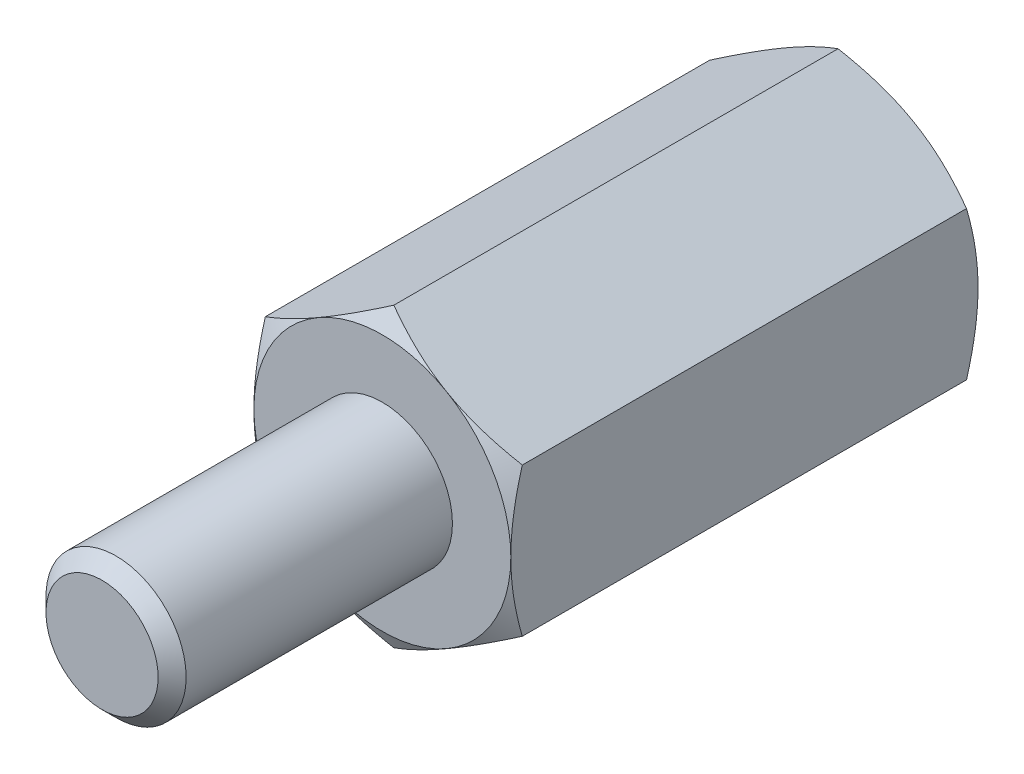
ISO-10303-21;
HEADER;
FILE_DESCRIPTION(('STEP AP214'),'2;1');
FILE_NAME('part.step','',(''),(''),'','','');
FILE_SCHEMA(('AUTOMOTIVE_DESIGN { 1 0 10303 214 1 1 1 1 }'));
ENDSEC;
DATA;
#1=APPLICATION_CONTEXT('core data for automotive mechanical design processes');
#2=APPLICATION_PROTOCOL_DEFINITION('international standard','automotive_design',2000,#1);
#3=PRODUCT_CONTEXT('',#1,'mechanical');
#4=PRODUCT('Part','Part','',(#3));
#5=PRODUCT_RELATED_PRODUCT_CATEGORY('part','',(#4));
#6=PRODUCT_DEFINITION_FORMATION('','',#4);
#7=PRODUCT_DEFINITION_CONTEXT('part definition',#1,'design');
#8=PRODUCT_DEFINITION('design','',#6,#7);
#9=PRODUCT_DEFINITION_SHAPE('','',#8);
#10=(LENGTH_UNIT() NAMED_UNIT(*) SI_UNIT(.MILLI.,.METRE.));
#11=(NAMED_UNIT(*) PLANE_ANGLE_UNIT() SI_UNIT($,.RADIAN.));
#12=(NAMED_UNIT(*) SI_UNIT($,.STERADIAN.) SOLID_ANGLE_UNIT());
#13=UNCERTAINTY_MEASURE_WITH_UNIT(LENGTH_MEASURE(1.E-05),#10,'distance_accuracy_value','');
#14=(GEOMETRIC_REPRESENTATION_CONTEXT(3) GLOBAL_UNCERTAINTY_ASSIGNED_CONTEXT((#13)) GLOBAL_UNIT_ASSIGNED_CONTEXT((#10,
#11,#12)) REPRESENTATION_CONTEXT('',''));
#15=CARTESIAN_POINT('',(0.,0.,0.));
#16=DIRECTION('',(0.,0.,1.));
#17=DIRECTION('',(1.,0.,0.));
#18=AXIS2_PLACEMENT_3D('',#15,#16,#17);
#19=CARTESIAN_POINT('',(0.,3.17542648054295,-10.));
#20=DIRECTION('',(-0.5,0.866025403784439,0.));
#21=DIRECTION('',(-0.866025403784439,-0.5,0.));
#22=AXIS2_PLACEMENT_3D('',#19,#20,#21);
#23=PLANE('',#22);
#24=DIRECTION('',(0.,0.,1.));
#25=VECTOR('',#24,1.);
#26=CARTESIAN_POINT('',(0.,3.17542648054295,-10.));
#27=LINE('',#26,#25);
#28=CARTESIAN_POINT('',(0.,3.17542648054295,-9.75437990693814));
#29=VERTEX_POINT('',#28);
#30=CARTESIAN_POINT('',(0.,3.17542648054295,-0.245620093061863));
#31=VERTEX_POINT('',#30);
#32=EDGE_CURVE('E247',#29,#31,#27,.T.);
#33=ORIENTED_EDGE('',*,*,#32,.F.);
#34=CARTESIAN_POINT('',(0.000199999999996883,3.17554195059678,-9.75431323663525));
#35=CARTESIAN_POINT('',(-0.12064922065991,3.10576962051743,-9.79461233775074));
#36=CARTESIAN_POINT('',(-0.242541602622638,3.03539502097908,-9.83126309740234));
#37=CARTESIAN_POINT('',(-0.488437126727897,2.89342717394439,-9.8952378170302));
#38=CARTESIAN_POINT('',(-0.612444638573859,2.82183140359859,-9.9225391443255));
#39=CARTESIAN_POINT('',(-0.858922797975947,2.67952717191843,-9.96503825470588));
#40=CARTESIAN_POINT('',(-0.98135551858742,2.60884060771578,-9.98051888137754));
#41=CARTESIAN_POINT('',(-1.22679714236892,2.46713482015519,-9.99900060263006));
#42=CARTESIAN_POINT('',(-1.34980515323291,2.39611611197038,-10.0020170005374));
#43=CARTESIAN_POINT('',(-1.57965878661079,2.26341005486544,-9.99574685457145));
#44=CARTESIAN_POINT('',(-1.68653879125402,2.20170285541369,-9.9879998457233));
#45=CARTESIAN_POINT('',(-1.89960246733475,2.07869048467395,-9.96344481893564));
#46=CARTESIAN_POINT('',(-2.00578540164889,2.01738573896434,-9.94662841034943));
#47=CARTESIAN_POINT('',(-2.21928848939319,1.89411967378235,-9.90458807765404));
#48=CARTESIAN_POINT('',(-2.32658161614286,1.83217395817123,-9.87918591931277));
#49=CARTESIAN_POINT('',(-2.53956747928405,1.70920651275308,-9.82153277416002));
#50=CARTESIAN_POINT('',(-2.64526294502665,1.64818320715446,-9.78929533670102));
#51=CARTESIAN_POINT('',(-2.7502,1.58759777021763,-9.75431323663524));
#52=B_SPLINE_CURVE_WITH_KNOTS('',3,(#34,#35,#36,#37,#38,#39,#40,#41,#42,#43,#44,#45,#46,#47,#48,
#49,#50,#51),.UNSPECIFIED.,.F.,.F.,(4,2,2,2,2,2,2,2,4),(0.,0.435912828725886,0.872873557116328,
1.29901931904671,1.72464171213573,2.09526089052937,2.46622354066374,2.84541551798557,
3.22386274754524),.UNSPECIFIED.);
#53=CARTESIAN_POINT('',(-1.375,2.38156986040721,-10.));
#54=VERTEX_POINT('',#53);
#55=EDGE_CURVE('E249',#29,#54,#52,.T.);
#56=ORIENTED_EDGE('',*,*,#55,.T.);
#57=CARTESIAN_POINT('',(-2.75,1.58771324027147,-9.75437990693814));
#58=VERTEX_POINT('',#57);
#59=EDGE_CURVE('E184',#54,#58,#52,.T.);
#60=ORIENTED_EDGE('',*,*,#59,.T.);
#61=DIRECTION('',(0.,0.,1.));
#62=VECTOR('',#61,1.);
#63=CARTESIAN_POINT('',(-2.75,1.58771324027147,-10.));
#64=LINE('',#63,#62);
#65=CARTESIAN_POINT('',(-2.75,1.58771324027147,-0.24562009306186));
#66=VERTEX_POINT('',#65);
#67=EDGE_CURVE('E257',#58,#66,#64,.T.);
#68=ORIENTED_EDGE('',*,*,#67,.T.);
#69=CARTESIAN_POINT('',(-2.7502,1.58759777021763,-0.245686763364758));
#70=CARTESIAN_POINT('',(-2.6293507793401,1.65737010029699,-0.205387662249262));
#71=CARTESIAN_POINT('',(-2.50745839737737,1.72774469983534,-0.168736902597662));
#72=CARTESIAN_POINT('',(-2.26156287327211,1.86971254687003,-0.104762182969801));
#73=CARTESIAN_POINT('',(-2.13755536142615,1.94130831721583,-0.0774608556744978));
#74=CARTESIAN_POINT('',(-1.89107720202406,2.08361254889599,-0.0349617452941181));
#75=CARTESIAN_POINT('',(-1.76864448141259,2.15429911309865,-0.0194811186224598));
#76=CARTESIAN_POINT('',(-1.52320285763109,2.29600490065923,-0.000999397369942171));
#77=CARTESIAN_POINT('',(-1.40019484676709,2.36702360884404,0.00201700053739949));
#78=CARTESIAN_POINT('',(-1.17034121338921,2.49972966594897,-0.00425314542854733));
#79=CARTESIAN_POINT('',(-1.06346120874598,2.56143686540073,-0.0120001542767036));
#80=CARTESIAN_POINT('',(-0.850397532665256,2.68444923614047,-0.036555181064356));
#81=CARTESIAN_POINT('',(-0.744214598351116,2.74575398185008,-0.0533715896505709));
#82=CARTESIAN_POINT('',(-0.530711510606821,2.86902004703207,-0.095411922345956));
#83=CARTESIAN_POINT('',(-0.42341838385715,2.93096576264319,-0.12081408068723));
#84=CARTESIAN_POINT('',(-0.210432520715954,3.05393320806134,-0.17846722583998));
#85=CARTESIAN_POINT('',(-0.104737054973352,3.11495651365995,-0.21070466329898));
#86=CARTESIAN_POINT('',(0.000199999999996798,3.17554195059678,-0.245686763364757));
#87=B_SPLINE_CURVE_WITH_KNOTS('',3,(#69,#70,#71,#72,#73,#74,#75,#76,#77,#78,#79,#80,#81,#82,#83,
#84,#85,#86),.UNSPECIFIED.,.F.,.F.,(4,2,2,2,2,2,2,2,4),(0.,0.435912828725887,0.87287355711633,
1.29901931904671,1.72464171213573,2.09526089052937,2.46622354066374,2.84541551798557,
3.22386274754524),.UNSPECIFIED.);
#88=CARTESIAN_POINT('',(-1.375,2.38156986040721,0.));
#89=VERTEX_POINT('',#88);
#90=EDGE_CURVE('E269',#66,#89,#87,.T.);
#91=ORIENTED_EDGE('',*,*,#90,.T.);
#92=EDGE_CURVE('E252',#89,#31,#87,.T.);
#93=ORIENTED_EDGE('',*,*,#92,.T.);
#94=EDGE_LOOP('',(#33,#56,#60,#68,#91,#93));
#95=FACE_BOUND('',#94,.T.);
#96=ADVANCED_FACE('F17',(#95),#23,.T.);
#97=CARTESIAN_POINT('',(-2.75,1.58771324027147,-10.));
#98=DIRECTION('',(-1.,0.,0.));
#99=DIRECTION('',(0.,-1.,0.));
#100=AXIS2_PLACEMENT_3D('',#97,#98,#99);
#101=PLANE('',#100);
#102=ORIENTED_EDGE('',*,*,#67,.F.);
#103=CARTESIAN_POINT('',(-2.75,-4.21084949309675,-8.68405156039709));
#104=CARTESIAN_POINT('',(-2.75,-4.09010894214089,-8.74240006384779));
#105=CARTESIAN_POINT('',(-2.75,-3.96908292065509,-8.80016853488244));
#106=CARTESIAN_POINT('',(-2.75,-3.72630558284843,-8.91421396157698));
#107=CARTESIAN_POINT('',(-2.75,-3.604554145362,-8.97049065899755));
#108=CARTESIAN_POINT('',(-2.75,-3.35951393034354,-9.08151755664727));
#109=CARTESIAN_POINT('',(-2.75,-3.23622034236436,-9.13625717839418));
#110=CARTESIAN_POINT('',(-2.75,-2.98861980138743,-9.24338522252357));
#111=CARTESIAN_POINT('',(-2.75,-2.86431290161182,-9.29577376746325));
#112=CARTESIAN_POINT('',(-2.75,-2.61294485887172,-9.39819642785389));
#113=CARTESIAN_POINT('',(-2.75,-2.48586863815654,-9.44819374210162));
#114=CARTESIAN_POINT('',(-2.75,-2.23021732171541,-9.54427259121541));
#115=CARTESIAN_POINT('',(-2.75,-2.10164206103363,-9.59035369042304));
#116=CARTESIAN_POINT('',(-2.75,-1.84305218799467,-9.67736192295378));
#117=CARTESIAN_POINT('',(-2.75,-1.71304130052583,-9.71830001358612));
#118=CARTESIAN_POINT('',(-2.75,-1.45117125062147,-9.79369269237566));
#119=CARTESIAN_POINT('',(-2.75,-1.31931268690202,-9.82814933084724));
#120=CARTESIAN_POINT('',(-2.75,-1.05365722480012,-9.8889063284691));
#121=CARTESIAN_POINT('',(-2.75,-0.91985982021759,-9.91520451590488));
#122=CARTESIAN_POINT('',(-2.75,-0.65065187403738,-9.95787396280339));
#123=CARTESIAN_POINT('',(-2.75,-0.515241331013594,-9.97424521348946));
#124=CARTESIAN_POINT('',(-2.75,-0.244373242869211,-9.99561250345976));
#125=CARTESIAN_POINT('',(-2.75,-0.108921526377133,-10.0006805567732));
#126=CARTESIAN_POINT('',(-2.75,0.161887058855133,-9.99917220436733));
#127=CARTESIAN_POINT('',(-2.75,0.297243943089639,-9.99259882131445));
#128=CARTESIAN_POINT('',(-2.75,0.528385436717542,-9.97189586995316));
#129=CARTESIAN_POINT('',(-2.75,0.624425050137503,-9.96046235896981));
#130=CARTESIAN_POINT('',(-2.75,0.815762399811551,-9.93247828038665));
#131=CARTESIAN_POINT('',(-2.75,0.911060016631976,-9.91592690577232));
#132=CARTESIAN_POINT('',(-2.75,1.19576218748918,-9.85946463872171));
#133=CARTESIAN_POINT('',(-2.75,1.38383224738499,-9.8127601405827));
#134=CARTESIAN_POINT('',(-2.75,1.66525048947488,-9.73220750296942));
#135=CARTESIAN_POINT('',(-2.75,1.76006556248561,-9.7031966650045));
#136=CARTESIAN_POINT('',(-2.75,1.94870609382219,-9.64230435109341));
#137=CARTESIAN_POINT('',(-2.75,2.042532185537,-9.61042485512149));
#138=CARTESIAN_POINT('',(-2.75,2.22880240354989,-9.54445858181354));
#139=CARTESIAN_POINT('',(-2.75,2.32125133588456,-9.51038523854446));
#140=CARTESIAN_POINT('',(-2.75,2.50543192042634,-9.44023863176888));
#141=CARTESIAN_POINT('',(-2.75,2.59716326539585,-9.40416455996268));
#142=CARTESIAN_POINT('',(-2.75,2.68856293053352,-9.36728755800251));
#143=B_SPLINE_CURVE_WITH_KNOTS('',3,(#103,#104,#105,#106,#107,#108,#109,#110,#111,#112,#113,
#114,#115,#116,#117,#118,#119,#120,#121,#122,#123,#124,#125,#126,#127,#128,#129,#130,#131,#132,
#133,#134,#135,#136,#137,#138,#139,#140,#141,#142),.UNSPECIFIED.,.F.,.F.,(4,2,2,2,2,2,2,2,2,2,2,
2,2,2,2,2,2,2,2,4),(0.,0.402305607365935,0.804680408536994,1.20935783819117,1.61401414820818,
2.02363838185769,2.43330812457348,2.84208969479599,3.25074173456635,3.65950246109142,
4.06826354901182,4.47441284024649,4.8804566914117,5.17046846817545,5.46052599902452,
6.04107275309884,6.33851131304664,6.63574613017458,6.93130791005796,7.22698998004827),.UNSPECIFIED.);
#144=CARTESIAN_POINT('',(-2.75,0.,-10.));
#145=VERTEX_POINT('',#144);
#146=EDGE_CURVE('E182',#58,#145,#143,.F.);
#147=ORIENTED_EDGE('',*,*,#146,.T.);
#148=CARTESIAN_POINT('',(-2.75,-1.58771324027147,-9.75437990693814));
#149=VERTEX_POINT('',#148);
#150=EDGE_CURVE('E176',#145,#149,#143,.F.);
#151=ORIENTED_EDGE('',*,*,#150,.T.);
#152=DIRECTION('',(0.,0.,1.));
#153=VECTOR('',#152,1.);
#154=CARTESIAN_POINT('',(-2.75,-1.58771324027147,-10.));
#155=LINE('',#154,#153);
#156=CARTESIAN_POINT('',(-2.75,-1.58771324027147,-0.24562009306186));
#157=VERTEX_POINT('',#156);
#158=EDGE_CURVE('E260',#149,#157,#155,.T.);
#159=ORIENTED_EDGE('',*,*,#158,.T.);
#160=CARTESIAN_POINT('',(-2.75,-4.21084949309675,-1.31594843960291));
#161=CARTESIAN_POINT('',(-2.75,-4.09010894214089,-1.25759993615222));
#162=CARTESIAN_POINT('',(-2.75,-3.96908292065509,-1.19983146511756));
#163=CARTESIAN_POINT('',(-2.75,-3.72630558284843,-1.08578603842303));
#164=CARTESIAN_POINT('',(-2.75,-3.604554145362,-1.02950934100245));
#165=CARTESIAN_POINT('',(-2.75,-3.35951393034354,-0.918482443352739));
#166=CARTESIAN_POINT('',(-2.75,-3.23622034236436,-0.863742821605821));
#167=CARTESIAN_POINT('',(-2.75,-2.98861980138743,-0.756614777476438));
#168=CARTESIAN_POINT('',(-2.75,-2.86431290161182,-0.704226232536749));
#169=CARTESIAN_POINT('',(-2.75,-2.61294485887172,-0.601803572146111));
#170=CARTESIAN_POINT('',(-2.75,-2.48586863815654,-0.551806257898382));
#171=CARTESIAN_POINT('',(-2.75,-2.2302173217154,-0.455727408784591));
#172=CARTESIAN_POINT('',(-2.75,-2.10164206103363,-0.409646309576962));
#173=CARTESIAN_POINT('',(-2.75,-1.84305218799467,-0.322638077046223));
#174=CARTESIAN_POINT('',(-2.75,-1.71304130052583,-0.281699986413881));
#175=CARTESIAN_POINT('',(-2.75,-1.45117125062147,-0.206307307624344));
#176=CARTESIAN_POINT('',(-2.75,-1.31931268690202,-0.171850669152764));
#177=CARTESIAN_POINT('',(-2.75,-1.05365722480012,-0.111093671530902));
#178=CARTESIAN_POINT('',(-2.75,-0.91985982021759,-0.0847954840951189));
#179=CARTESIAN_POINT('',(-2.75,-0.65065187403738,-0.0421260371966088));
#180=CARTESIAN_POINT('',(-2.75,-0.515241331013594,-0.0257547865105416));
#181=CARTESIAN_POINT('',(-2.75,-0.244373242869211,-0.00438749654023648));
#182=CARTESIAN_POINT('',(-2.75,-0.108921526377133,0.000680556773217411));
#183=CARTESIAN_POINT('',(-2.75,0.161887058855133,-0.000827795632671751));
#184=CARTESIAN_POINT('',(-2.75,0.297243943089639,-0.00740117868555519));
#185=CARTESIAN_POINT('',(-2.75,0.528385436717543,-0.0281041300468446));
#186=CARTESIAN_POINT('',(-2.75,0.624425050137504,-0.0395376410301878));
#187=CARTESIAN_POINT('',(-2.75,0.815762399811552,-0.0675217196133499));
#188=CARTESIAN_POINT('',(-2.75,0.911060016631977,-0.0840730942276818));
#189=CARTESIAN_POINT('',(-2.75,1.19576218748918,-0.140535361278285));
#190=CARTESIAN_POINT('',(-2.75,1.38383224738499,-0.187239859417295));
#191=CARTESIAN_POINT('',(-2.75,1.66525048947488,-0.267792497030581));
#192=CARTESIAN_POINT('',(-2.75,1.76006556248561,-0.296803334995504));
#193=CARTESIAN_POINT('',(-2.75,1.94870609382219,-0.357695648906592));
#194=CARTESIAN_POINT('',(-2.75,2.042532185537,-0.389575144878509));
#195=CARTESIAN_POINT('',(-2.75,2.22880240354989,-0.455541418186455));
#196=CARTESIAN_POINT('',(-2.75,2.32125133588456,-0.48961476145554));
#197=CARTESIAN_POINT('',(-2.75,2.50543192042633,-0.559761368231118));
#198=CARTESIAN_POINT('',(-2.75,2.59716326539584,-0.595835440037327));
#199=CARTESIAN_POINT('',(-2.75,2.68856293053351,-0.632712441997495));
#200=B_SPLINE_CURVE_WITH_KNOTS('',3,(#160,#161,#162,#163,#164,#165,#166,#167,#168,#169,#170,
#171,#172,#173,#174,#175,#176,#177,#178,#179,#180,#181,#182,#183,#184,#185,#186,#187,#188,#189,
#190,#191,#192,#193,#194,#195,#196,#197,#198,#199),.UNSPECIFIED.,.F.,.F.,(4,2,2,2,2,2,2,2,2,2,2,
2,2,2,2,2,2,2,2,4),(0.,0.402305607365936,0.804680408536995,1.20935783819118,1.61401414820818,
2.02363838185769,2.43330812457348,2.84208969479599,3.25074173456635,3.65950246109142,
4.06826354901183,4.47441284024649,4.8804566914117,5.17046846817545,5.46052599902452,
6.04107275309884,6.33851131304663,6.63574613017457,6.93130791005796,7.22698998004827),.UNSPECIFIED.);
#201=CARTESIAN_POINT('',(-2.75,0.,0.));
#202=VERTEX_POINT('',#201);
#203=EDGE_CURVE('E205',#157,#202,#200,.T.);
#204=ORIENTED_EDGE('',*,*,#203,.T.);
#205=EDGE_CURVE('E199',#202,#66,#200,.T.);
#206=ORIENTED_EDGE('',*,*,#205,.T.);
#207=EDGE_LOOP('',(#102,#147,#151,#159,#204,#206));
#208=FACE_BOUND('',#207,.T.);
#209=ADVANCED_FACE('F190',(#208),#101,.T.);
#210=CARTESIAN_POINT('',(-2.75,-1.58771324027147,-10.));
#211=DIRECTION('',(-0.5,-0.866025403784439,0.));
#212=DIRECTION('',(0.866025403784439,-0.5,0.));
#213=AXIS2_PLACEMENT_3D('',#210,#211,#212);
#214=PLANE('',#213);
#215=ORIENTED_EDGE('',*,*,#158,.F.);
#216=CARTESIAN_POINT('',(-2.7502,-1.58759777021763,-9.75431323663524));
#217=CARTESIAN_POINT('',(-2.62935077934009,-1.65737010029699,-9.79461233775074));
#218=CARTESIAN_POINT('',(-2.50745839737737,-1.72774469983533,-9.83126309740234));
#219=CARTESIAN_POINT('',(-2.26156287327211,-1.86971254687003,-9.8952378170302));
#220=CARTESIAN_POINT('',(-2.13755536142614,-1.94130831721583,-9.9225391443255));
#221=CARTESIAN_POINT('',(-1.89107720202406,-2.08361254889599,-9.96503825470589));
#222=CARTESIAN_POINT('',(-1.76864448141258,-2.15429911309864,-9.98051888137754));
#223=CARTESIAN_POINT('',(-1.52320285763109,-2.29600490065923,-9.99900060263006));
#224=CARTESIAN_POINT('',(-1.40019484676709,-2.36702360884404,-10.0020170005374));
#225=CARTESIAN_POINT('',(-1.17034121338921,-2.49972966594897,-9.99574685457145));
#226=CARTESIAN_POINT('',(-1.06346120874598,-2.56143686540073,-9.9879998457233));
#227=CARTESIAN_POINT('',(-0.85039753266525,-2.68444923614046,-9.96344481893565));
#228=CARTESIAN_POINT('',(-0.74421459835111,-2.74575398185008,-9.94662841034943));
#229=CARTESIAN_POINT('',(-0.530711510606814,-2.86902004703206,-9.90458807765405));
#230=CARTESIAN_POINT('',(-0.423418383857142,-2.93096576264318,-9.87918591931277));
#231=CARTESIAN_POINT('',(-0.210432520715946,-3.05393320806134,-9.82153277416002));
#232=CARTESIAN_POINT('',(-0.104737054973345,-3.11495651365995,-9.78929533670102));
#233=CARTESIAN_POINT('',(0.00020000000000036,-3.17554195059679,-9.75431323663524));
#234=B_SPLINE_CURVE_WITH_KNOTS('',3,(#216,#217,#218,#219,#220,#221,#222,#223,#224,#225,#226,
#227,#228,#229,#230,#231,#232,#233),.UNSPECIFIED.,.F.,.F.,(4,2,2,2,2,2,2,2,4),(0.,
0.435912828725888,0.872873557116331,1.29901931904671,1.72464171213573,2.09526089052937,
2.46622354066374,2.84541551798557,3.22386274754525),.UNSPECIFIED.);
#235=CARTESIAN_POINT('',(-1.375,-2.38156986040721,-10.));
#236=VERTEX_POINT('',#235);
#237=EDGE_CURVE('E183',#149,#236,#234,.T.);
#238=ORIENTED_EDGE('',*,*,#237,.T.);
#239=CARTESIAN_POINT('',(0.,-3.17542648054295,-9.75437990693814));
#240=VERTEX_POINT('',#239);
#241=EDGE_CURVE('E170',#236,#240,#234,.T.);
#242=ORIENTED_EDGE('',*,*,#241,.T.);
#243=DIRECTION('',(0.,0.,1.));
#244=VECTOR('',#243,1.);
#245=CARTESIAN_POINT('',(0.,-3.17542648054295,-10.));
#246=LINE('',#245,#244);
#247=CARTESIAN_POINT('',(0.,-3.17542648054295,-0.24562009306186));
#248=VERTEX_POINT('',#247);
#249=EDGE_CURVE('E275',#240,#248,#246,.T.);
#250=ORIENTED_EDGE('',*,*,#249,.T.);
#251=CARTESIAN_POINT('',(0.000200000000000498,-3.17554195059679,-0.245686763364758));
#252=CARTESIAN_POINT('',(-0.120649220659903,-3.10576962051743,-0.20538766224926));
#253=CARTESIAN_POINT('',(-0.242541602622631,-3.03539502097908,-0.168736902597659));
#254=CARTESIAN_POINT('',(-0.488437126727889,-2.89342717394439,-0.104762182969798));
#255=CARTESIAN_POINT('',(-0.612444638573852,-2.82183140359858,-0.0774608556744953));
#256=CARTESIAN_POINT('',(-0.858922797975941,-2.67952717191842,-0.034961745294115));
#257=CARTESIAN_POINT('',(-0.981355518587414,-2.60884060771577,-0.0194811186224558));
#258=CARTESIAN_POINT('',(-1.22679714236891,-2.46713482015519,-0.000999397369939789));
#259=CARTESIAN_POINT('',(-1.34980515323291,-2.39611611197038,0.00201700053739949));
#260=CARTESIAN_POINT('',(-1.57965878661079,-2.26341005486544,-0.00425314542854709));
#261=CARTESIAN_POINT('',(-1.68653879125402,-2.20170285541369,-0.0120001542767013));
#262=CARTESIAN_POINT('',(-1.89960246733475,-2.07869048467395,-0.0365551810643522));
#263=CARTESIAN_POINT('',(-2.00578540164889,-2.01738573896433,-0.0533715896505677));
#264=CARTESIAN_POINT('',(-2.21928848939318,-1.89411967378235,-0.0954119223459533));
#265=CARTESIAN_POINT('',(-2.32658161614285,-1.83217395817123,-0.120814080687227));
#266=CARTESIAN_POINT('',(-2.53956747928405,-1.70920651275308,-0.178467225839978));
#267=CARTESIAN_POINT('',(-2.64526294502665,-1.64818320715446,-0.210704663298979));
#268=CARTESIAN_POINT('',(-2.7502,-1.58759777021763,-0.245686763364757));
#269=B_SPLINE_CURVE_WITH_KNOTS('',3,(#251,#252,#253,#254,#255,#256,#257,#258,#259,#260,#261,
#262,#263,#264,#265,#266,#267,#268),.UNSPECIFIED.,.F.,.F.,(4,2,2,2,2,2,2,2,4),(0.,
0.435912828725889,0.872873557116332,1.29901931904672,1.72464171213574,2.09526089052938,
2.46622354066374,2.84541551798557,3.22386274754524),.UNSPECIFIED.);
#270=CARTESIAN_POINT('',(-1.375,-2.38156986040721,0.));
#271=VERTEX_POINT('',#270);
#272=EDGE_CURVE('E213',#248,#271,#269,.T.);
#273=ORIENTED_EDGE('',*,*,#272,.T.);
#274=EDGE_CURVE('E207',#271,#157,#269,.T.);
#275=ORIENTED_EDGE('',*,*,#274,.T.);
#276=EDGE_LOOP('',(#215,#238,#242,#250,#273,#275));
#277=FACE_BOUND('',#276,.T.);
#278=ADVANCED_FACE('F193',(#277),#214,.T.);
#279=CARTESIAN_POINT('',(0.,-3.17542648054295,-10.));
#280=DIRECTION('',(0.5,-0.866025403784439,0.));
#281=DIRECTION('',(0.866025403784439,0.5,0.));
#282=AXIS2_PLACEMENT_3D('',#279,#280,#281);
#283=PLANE('',#282);
#284=ORIENTED_EDGE('',*,*,#249,.F.);
#285=CARTESIAN_POINT('',(-0.000199999999999599,-3.17554195059679,-9.75431323663524));
#286=CARTESIAN_POINT('',(0.120649220659906,-3.10576962051743,-9.79461233775074));
#287=CARTESIAN_POINT('',(0.242541602622633,-3.03539502097909,-9.83126309740234));
#288=CARTESIAN_POINT('',(0.488437126727892,-2.89342717394439,-9.8952378170302));
#289=CARTESIAN_POINT('',(0.612444638573854,-2.82183140359859,-9.9225391443255));
#290=CARTESIAN_POINT('',(0.858922797975943,-2.67952717191843,-9.96503825470588));
#291=CARTESIAN_POINT('',(0.981355518587417,-2.60884060771578,-9.98051888137754));
#292=CARTESIAN_POINT('',(1.22679714236891,-2.46713482015519,-9.99900060263006));
#293=CARTESIAN_POINT('',(1.34980515323291,-2.39611611197038,-10.0020170005374));
#294=CARTESIAN_POINT('',(1.57965878661079,-2.26341005486545,-9.99574685457145));
#295=CARTESIAN_POINT('',(1.68653879125402,-2.20170285541369,-9.9879998457233));
#296=CARTESIAN_POINT('',(1.89960246733475,-2.07869048467395,-9.96344481893565));
#297=CARTESIAN_POINT('',(2.00578540164889,-2.01738573896434,-9.94662841034943));
#298=CARTESIAN_POINT('',(2.21928848939318,-1.89411967378235,-9.90458807765404));
#299=CARTESIAN_POINT('',(2.32658161614285,-1.83217395817123,-9.87918591931277));
#300=CARTESIAN_POINT('',(2.53956747928405,-1.70920651275308,-9.82153277416002));
#301=CARTESIAN_POINT('',(2.64526294502665,-1.64818320715447,-9.78929533670102));
#302=CARTESIAN_POINT('',(2.7502,-1.58759777021764,-9.75431323663525));
#303=B_SPLINE_CURVE_WITH_KNOTS('',3,(#285,#286,#287,#288,#289,#290,#291,#292,#293,#294,#295,
#296,#297,#298,#299,#300,#301,#302),.UNSPECIFIED.,.F.,.F.,(4,2,2,2,2,2,2,2,4),(0.,
0.435912828725888,0.872873557116332,1.29901931904672,1.72464171213574,2.09526089052938,
2.46622354066374,2.84541551798557,3.22386274754524),.UNSPECIFIED.);
#304=CARTESIAN_POINT('',(1.375,-2.38156986040721,-10.));
#305=VERTEX_POINT('',#304);
#306=EDGE_CURVE('E40',#240,#305,#303,.T.);
#307=ORIENTED_EDGE('',*,*,#306,.T.);
#308=CARTESIAN_POINT('',(2.75,-1.58771324027148,-9.75437990693814));
#309=VERTEX_POINT('',#308);
#310=EDGE_CURVE('E136',#305,#309,#303,.T.);
#311=ORIENTED_EDGE('',*,*,#310,.T.);
#312=DIRECTION('',(0.,0.,1.));
#313=VECTOR('',#312,1.);
#314=CARTESIAN_POINT('',(2.75,-1.58771324027147,-10.));
#315=LINE('',#314,#313);
#316=CARTESIAN_POINT('',(2.75,-1.58771324027147,-0.24562009306186));
#317=VERTEX_POINT('',#316);
#318=EDGE_CURVE('E271',#309,#317,#315,.T.);
#319=ORIENTED_EDGE('',*,*,#318,.T.);
#320=CARTESIAN_POINT('',(2.7502,-1.58759777021764,-0.245686763364757));
#321=CARTESIAN_POINT('',(2.62935077934009,-1.65737010029699,-0.20538766224926));
#322=CARTESIAN_POINT('',(2.50745839737736,-1.72774469983534,-0.16873690259766));
#323=CARTESIAN_POINT('',(2.26156287327211,-1.86971254687003,-0.1047621829698));
#324=CARTESIAN_POINT('',(2.13755536142614,-1.94130831721583,-0.0774608556744968));
#325=CARTESIAN_POINT('',(1.89107720202405,-2.08361254889599,-0.034961745294117));
#326=CARTESIAN_POINT('',(1.76864448141258,-2.15429911309865,-0.0194811186224583));
#327=CARTESIAN_POINT('',(1.52320285763108,-2.29600490065923,-0.000999397369941444));
#328=CARTESIAN_POINT('',(1.40019484676709,-2.36702360884404,0.00201700053739911));
#329=CARTESIAN_POINT('',(1.17034121338921,-2.49972966594897,-0.00425314542854788));
#330=CARTESIAN_POINT('',(1.06346120874598,-2.56143686540073,-0.0120001542767034));
#331=CARTESIAN_POINT('',(0.850397532665249,-2.68444923614047,-0.0365551810643556));
#332=CARTESIAN_POINT('',(0.74421459835111,-2.74575398185008,-0.0533715896505711));
#333=CARTESIAN_POINT('',(0.530711510606815,-2.86902004703207,-0.0954119223459566));
#334=CARTESIAN_POINT('',(0.423418383857144,-2.93096576264319,-0.120814080687231));
#335=CARTESIAN_POINT('',(0.210432520715948,-3.05393320806134,-0.178467225839981));
#336=CARTESIAN_POINT('',(0.104737054973347,-3.11495651365996,-0.210704663298981));
#337=CARTESIAN_POINT('',(-0.000199999999999727,-3.17554195059679,-0.245686763364758));
#338=B_SPLINE_CURVE_WITH_KNOTS('',3,(#320,#321,#322,#323,#324,#325,#326,#327,#328,#329,#330,
#331,#332,#333,#334,#335,#336,#337),.UNSPECIFIED.,.F.,.F.,(4,2,2,2,2,2,2,2,4),(0.,
0.435912828725888,0.872873557116331,1.29901931904671,1.72464171213573,2.09526089052937,
2.46622354066374,2.84541551798557,3.22386274754524),.UNSPECIFIED.);
#339=CARTESIAN_POINT('',(1.375,-2.38156986040721,0.));
#340=VERTEX_POINT('',#339);
#341=EDGE_CURVE('E220',#317,#340,#338,.T.);
#342=ORIENTED_EDGE('',*,*,#341,.T.);
#343=EDGE_CURVE('E214',#340,#248,#338,.T.);
#344=ORIENTED_EDGE('',*,*,#343,.T.);
#345=EDGE_LOOP('',(#284,#307,#311,#319,#342,#344));
#346=FACE_BOUND('',#345,.T.);
#347=ADVANCED_FACE('F226',(#346),#283,.T.);
#348=CARTESIAN_POINT('',(2.75,-1.58771324027147,-10.));
#349=DIRECTION('',(1.,0.,0.));
#350=DIRECTION('',(0.,1.,0.));
#351=AXIS2_PLACEMENT_3D('',#348,#349,#350);
#352=PLANE('',#351);
#353=ORIENTED_EDGE('',*,*,#318,.F.);
#354=CARTESIAN_POINT('',(2.75,-4.21085047466775,-8.68405108591024));
#355=CARTESIAN_POINT('',(2.75,-4.09010989011095,-8.74239960966294));
#356=CARTESIAN_POINT('',(2.75,-3.96908383499853,-8.80016810098766));
#357=CARTESIAN_POINT('',(2.75,-3.72630642982622,-8.91421356815426));
#358=CARTESIAN_POINT('',(2.75,-3.60455495860072,-8.97049028575683));
#359=CARTESIAN_POINT('',(2.75,-3.35951467553998,-9.08151722378069));
#360=CARTESIAN_POINT('',(2.75,-3.23622105325521,-9.13625686571548));
#361=CARTESIAN_POINT('',(2.75,-2.98862044341193,-9.2433849498491));
#362=CARTESIAN_POINT('',(2.75,-2.86431350907558,-9.29577351460521));
#363=CARTESIAN_POINT('',(2.75,-2.61294539628322,-9.39819621428788));
#364=CARTESIAN_POINT('',(2.75,-2.48586914007059,-9.44819354800062));
#365=CARTESIAN_POINT('',(2.75,-2.23021775204037,-9.54427243496487));
#366=CARTESIAN_POINT('',(2.75,-2.1016424552668,-9.59035355255758));
#367=CARTESIAN_POINT('',(2.75,-1.84305250936245,-9.67736182002804));
#368=CARTESIAN_POINT('',(2.75,-1.71304158512251,-9.71829992722098));
#369=CARTESIAN_POINT('',(2.75,-1.45117146066374,-9.79369263632952));
#370=CARTESIAN_POINT('',(2.75,-1.31931285916158,-9.82814928856133));
#371=CARTESIAN_POINT('',(2.75,-1.05365730058872,-9.88890631402182));
#372=CARTESIAN_POINT('',(2.75,-0.919859837035222,-9.91520451432338));
#373=CARTESIAN_POINT('',(2.75,-0.650651771588407,-9.95787397795958));
#374=CARTESIAN_POINT('',(2.75,-0.515241168270033,-9.974245232524));
#375=CARTESIAN_POINT('',(2.75,-0.244372959827895,-9.99561251963743));
#376=CARTESIAN_POINT('',(2.75,-0.10892118333661,-10.0006805663044));
#377=CARTESIAN_POINT('',(2.75,0.161887520872979,-9.99917219036022));
#378=CARTESIAN_POINT('',(2.75,0.297244464085851,-9.99259879041321));
#379=CARTESIAN_POINT('',(2.75,0.528386033126785,-9.97189580522956));
#380=CARTESIAN_POINT('',(2.75,0.624425663637133,-9.96046228070885));
#381=CARTESIAN_POINT('',(2.75,0.815763046773995,-9.93247817430538));
#382=CARTESIAN_POINT('',(2.75,0.911060679966731,-9.91592678540798));
#383=CARTESIAN_POINT('',(2.75,1.19576289915276,-9.85946447516099));
#384=CARTESIAN_POINT('',(2.75,1.38383299011474,-9.81275994778995));
#385=CARTESIAN_POINT('',(2.75,1.66525127863567,-9.73220726693515));
#386=CARTESIAN_POINT('',(2.75,1.76006636738015,-9.70319641445221));
#387=CARTESIAN_POINT('',(2.75,1.94870693000561,-9.64230407192395));
#388=CARTESIAN_POINT('',(2.75,2.04253303727579,-9.61042456185308));
#389=CARTESIAN_POINT('',(2.75,2.22880328617383,-9.54445826089924));
#390=CARTESIAN_POINT('',(2.75,2.32125223383934,-9.51038490408283));
#391=CARTESIAN_POINT('',(2.75,2.5054328490763,-9.44023827062063));
#392=CARTESIAN_POINT('',(2.75,2.59716420940992,-9.40416418567469));
#393=CARTESIAN_POINT('',(2.75,2.68856388993767,-9.36728717077666));
#394=B_SPLINE_CURVE_WITH_KNOTS('',3,(#354,#355,#356,#357,#358,#359,#360,#361,#362,#363,#364,
#365,#366,#367,#368,#369,#370,#371,#372,#373,#374,#375,#376,#377,#378,#379,#380,#381,#382,#383,
#384,#385,#386,#387,#388,#389,#390,#391,#392,#393),.UNSPECIFIED.,.F.,.F.,(4,2,2,2,2,2,2,2,2,2,2,
2,2,2,2,2,2,2,2,4),(0.,0.402305724628121,0.80468064308082,1.20935819137344,1.61401462001939,
2.02363897413607,2.43330883735974,2.84209052765639,3.25074268740349,3.65950359456049,
4.06826486284691,4.47441433252271,4.88045836225494,5.17047019471948,5.46052778127857,
6.04107464708557,6.33851326493238,6.63574813987144,6.93130997697814,7.22699210430481),.UNSPECIFIED.);
#395=CARTESIAN_POINT('',(2.75,0.,-10.));
#396=VERTEX_POINT('',#395);
#397=EDGE_CURVE('E135',#309,#396,#394,.T.);
#398=ORIENTED_EDGE('',*,*,#397,.T.);
#399=CARTESIAN_POINT('',(2.75,1.58771324027147,-9.75437990693814));
#400=VERTEX_POINT('',#399);
#401=EDGE_CURVE('E127',#396,#400,#394,.T.);
#402=ORIENTED_EDGE('',*,*,#401,.T.);
#403=DIRECTION('',(0.,0.,1.));
#404=VECTOR('',#403,1.);
#405=CARTESIAN_POINT('',(2.75,1.58771324027147,-10.));
#406=LINE('',#405,#404);
#407=CARTESIAN_POINT('',(2.75,1.58771324027149,-0.24562009306186));
#408=VERTEX_POINT('',#407);
#409=EDGE_CURVE('E270',#400,#408,#406,.T.);
#410=ORIENTED_EDGE('',*,*,#409,.T.);
#411=CARTESIAN_POINT('',(2.75,-4.21084949309675,-1.31594843960291));
#412=CARTESIAN_POINT('',(2.75,-4.09010894214089,-1.25759993615222));
#413=CARTESIAN_POINT('',(2.75,-3.96908292065509,-1.19983146511756));
#414=CARTESIAN_POINT('',(2.75,-3.72630558284843,-1.08578603842303));
#415=CARTESIAN_POINT('',(2.75,-3.604554145362,-1.02950934100245));
#416=CARTESIAN_POINT('',(2.75,-3.35951393034354,-0.91848244335274));
#417=CARTESIAN_POINT('',(2.75,-3.23622034236436,-0.863742821605822));
#418=CARTESIAN_POINT('',(2.75,-2.98861980138743,-0.75661477747644));
#419=CARTESIAN_POINT('',(2.75,-2.86431290161182,-0.70422623253675));
#420=CARTESIAN_POINT('',(2.75,-2.61294485887172,-0.601803572146112));
#421=CARTESIAN_POINT('',(2.75,-2.48586863815654,-0.551806257898383));
#422=CARTESIAN_POINT('',(2.75,-2.23021732171541,-0.455727408784592));
#423=CARTESIAN_POINT('',(2.75,-2.10164206103363,-0.409646309576963));
#424=CARTESIAN_POINT('',(2.75,-1.84305218799467,-0.322638077046225));
#425=CARTESIAN_POINT('',(2.75,-1.71304130052583,-0.281699986413883));
#426=CARTESIAN_POINT('',(2.75,-1.45117125062148,-0.206307307624344));
#427=CARTESIAN_POINT('',(2.75,-1.31931268690202,-0.171850669152763));
#428=CARTESIAN_POINT('',(2.75,-1.05365722480013,-0.111093671530901));
#429=CARTESIAN_POINT('',(2.75,-0.919859820217594,-0.0847954840951193));
#430=CARTESIAN_POINT('',(2.75,-0.650651874037385,-0.04212603719661));
#431=CARTESIAN_POINT('',(2.75,-0.515241331013599,-0.025754786510542));
#432=CARTESIAN_POINT('',(2.75,-0.244373242869216,-0.00438749654023654));
#433=CARTESIAN_POINT('',(2.75,-0.108921526377138,0.000680556773216662));
#434=CARTESIAN_POINT('',(2.75,0.161887058855128,-0.000827795632670412));
#435=CARTESIAN_POINT('',(2.75,0.297243943089634,-0.00740117868555103));
#436=CARTESIAN_POINT('',(2.75,0.528385436717538,-0.0281041300468407));
#437=CARTESIAN_POINT('',(2.75,0.624425050137498,-0.0395376410301856));
#438=CARTESIAN_POINT('',(2.75,0.815762399811545,-0.0675217196133487));
#439=CARTESIAN_POINT('',(2.75,0.911060016631969,-0.0840730942276799));
#440=CARTESIAN_POINT('',(2.75,1.19576218748917,-0.140535361278282));
#441=CARTESIAN_POINT('',(2.75,1.38383224738498,-0.187239859417292));
#442=CARTESIAN_POINT('',(2.75,1.66525048947487,-0.267792497030578));
#443=CARTESIAN_POINT('',(2.75,1.7600655624856,-0.296803334995501));
#444=CARTESIAN_POINT('',(2.75,1.94870609382218,-0.357695648906588));
#445=CARTESIAN_POINT('',(2.75,2.04253218553699,-0.389575144878504));
#446=CARTESIAN_POINT('',(2.75,2.22880240354987,-0.45554141818645));
#447=CARTESIAN_POINT('',(2.75,2.32125133588455,-0.489614761455535));
#448=CARTESIAN_POINT('',(2.75,2.50543192042632,-0.559761368231111));
#449=CARTESIAN_POINT('',(2.75,2.59716326539583,-0.59583544003732));
#450=CARTESIAN_POINT('',(2.75,2.6885629305335,-0.632712441997485));
#451=B_SPLINE_CURVE_WITH_KNOTS('',3,(#411,#412,#413,#414,#415,#416,#417,#418,#419,#420,#421,
#422,#423,#424,#425,#426,#427,#428,#429,#430,#431,#432,#433,#434,#435,#436,#437,#438,#439,#440,
#441,#442,#443,#444,#445,#446,#447,#448,#449,#450),.UNSPECIFIED.,.F.,.F.,(4,2,2,2,2,2,2,2,2,2,2,
2,2,2,2,2,2,2,2,4),(0.,0.402305607365935,0.804680408536994,1.20935783819117,1.61401414820818,
2.02363838185769,2.43330812457348,2.84208969479599,3.25074173456635,3.65950246109142,
4.06826354901182,4.47441284024648,4.8804566914117,5.17046846817545,5.46052599902452,
6.04107275309883,6.33851131304662,6.63574613017456,6.93130791005794,7.22698998004825),.UNSPECIFIED.);
#452=CARTESIAN_POINT('',(2.75,0.,0.));
#453=VERTEX_POINT('',#452);
#454=EDGE_CURVE('E321',#408,#453,#451,.F.);
#455=ORIENTED_EDGE('',*,*,#454,.T.);
#456=EDGE_CURVE('E221',#453,#317,#451,.F.);
#457=ORIENTED_EDGE('',*,*,#456,.T.);
#458=EDGE_LOOP('',(#353,#398,#402,#410,#455,#457));
#459=FACE_BOUND('',#458,.T.);
#460=ADVANCED_FACE('F142',(#459),#352,.T.);
#461=CARTESIAN_POINT('',(2.75,1.58771324027147,-10.));
#462=DIRECTION('',(0.5,0.866025403784439,0.));
#463=DIRECTION('',(-0.866025403784439,0.5,0.));
#464=AXIS2_PLACEMENT_3D('',#461,#462,#463);
#465=PLANE('',#464);
#466=ORIENTED_EDGE('',*,*,#409,.F.);
#467=CARTESIAN_POINT('',(2.7502,1.58759777021763,-9.75431323663525));
#468=CARTESIAN_POINT('',(2.62935077934009,1.65737010029699,-9.79461233775074));
#469=CARTESIAN_POINT('',(2.50745839737737,1.72774469983534,-9.83126309740234));
#470=CARTESIAN_POINT('',(2.26156287327211,1.86971254687003,-9.8952378170302));
#471=CARTESIAN_POINT('',(2.13755536142615,1.94130831721583,-9.9225391443255));
#472=CARTESIAN_POINT('',(1.89107720202406,2.08361254889599,-9.96503825470588));
#473=CARTESIAN_POINT('',(1.76864448141258,2.15429911309865,-9.98051888137754));
#474=CARTESIAN_POINT('',(1.52320285763108,2.29600490065923,-9.99900060263006));
#475=CARTESIAN_POINT('',(1.40019484676709,2.36702360884404,-10.0020170005374));
#476=CARTESIAN_POINT('',(1.17034121338921,2.49972966594897,-9.99574685457145));
#477=CARTESIAN_POINT('',(1.06346120874598,2.56143686540073,-9.9879998457233));
#478=CARTESIAN_POINT('',(0.850397532665251,2.68444923614047,-9.96344481893564));
#479=CARTESIAN_POINT('',(0.744214598351111,2.74575398185008,-9.94662841034943));
#480=CARTESIAN_POINT('',(0.530711510606817,2.86902004703207,-9.90458807765405));
#481=CARTESIAN_POINT('',(0.423418383857146,2.93096576264319,-9.87918591931277));
#482=CARTESIAN_POINT('',(0.210432520715949,3.05393320806134,-9.82153277416002));
#483=CARTESIAN_POINT('',(0.104737054973347,3.11495651365995,-9.78929533670102));
#484=CARTESIAN_POINT('',(-0.000200000000003067,3.17554195059678,-9.75431323663525));
#485=B_SPLINE_CURVE_WITH_KNOTS('',3,(#467,#468,#469,#470,#471,#472,#473,#474,#475,#476,#477,
#478,#479,#480,#481,#482,#483,#484),.UNSPECIFIED.,.F.,.F.,(4,2,2,2,2,2,2,2,4),(0.,
0.435912828725886,0.872873557116329,1.29901931904671,1.72464171213573,2.09526089052937,
2.46622354066374,2.84541551798557,3.22386274754524),.UNSPECIFIED.);
#486=CARTESIAN_POINT('',(1.375,2.38156986040721,-10.));
#487=VERTEX_POINT('',#486);
#488=EDGE_CURVE('E347',#400,#487,#485,.T.);
#489=ORIENTED_EDGE('',*,*,#488,.T.);
#490=EDGE_CURVE('E159',#487,#29,#485,.T.);
#491=ORIENTED_EDGE('',*,*,#490,.T.);
#492=ORIENTED_EDGE('',*,*,#32,.T.);
#493=CARTESIAN_POINT('',(-0.000200000000003116,3.17554195059678,-0.245686763364757));
#494=CARTESIAN_POINT('',(0.120649220659904,3.10576962051743,-0.205387662249262));
#495=CARTESIAN_POINT('',(0.242541602622632,3.03539502097908,-0.168736902597661));
#496=CARTESIAN_POINT('',(0.488437126727891,2.89342717394439,-0.104762182969801));
#497=CARTESIAN_POINT('',(0.612444638573854,2.82183140359859,-0.0774608556744979));
#498=CARTESIAN_POINT('',(0.858922797975942,2.67952717191843,-0.0349617452941179));
#499=CARTESIAN_POINT('',(0.981355518587416,2.60884060771578,-0.0194811186224592));
#500=CARTESIAN_POINT('',(1.22679714236891,2.46713482015519,-0.000999397369941185));
#501=CARTESIAN_POINT('',(1.34980515323291,2.39611611197038,0.00201700053740072));
#502=CARTESIAN_POINT('',(1.57965878661079,2.26341005486545,-0.00425314542854606));
#503=CARTESIAN_POINT('',(1.68653879125402,2.20170285541369,-0.0120001542767025));
#504=CARTESIAN_POINT('',(1.89960246733475,2.07869048467395,-0.0365551810643552));
#505=CARTESIAN_POINT('',(2.00578540164889,2.01738573896434,-0.0533715896505702));
#506=CARTESIAN_POINT('',(2.21928848939318,1.89411967378235,-0.0954119223459556));
#507=CARTESIAN_POINT('',(2.32658161614285,1.83217395817123,-0.12081408068723));
#508=CARTESIAN_POINT('',(2.53956747928405,1.70920651275308,-0.17846722583998));
#509=CARTESIAN_POINT('',(2.64526294502665,1.64818320715446,-0.210704663298979));
#510=CARTESIAN_POINT('',(2.7502,1.58759777021763,-0.245686763364755));
#511=B_SPLINE_CURVE_WITH_KNOTS('',3,(#493,#494,#495,#496,#497,#498,#499,#500,#501,#502,#503,
#504,#505,#506,#507,#508,#509,#510),.UNSPECIFIED.,.F.,.F.,(4,2,2,2,2,2,2,2,4),(0.,
0.435912828725887,0.87287355711633,1.29901931904671,1.72464171213573,2.09526089052937,
2.46622354066374,2.84541551798557,3.22386274754524),.UNSPECIFIED.);
#512=CARTESIAN_POINT('',(1.375,2.38156986040721,0.));
#513=VERTEX_POINT('',#512);
#514=EDGE_CURVE('E263',#31,#513,#511,.T.);
#515=ORIENTED_EDGE('',*,*,#514,.T.);
#516=EDGE_CURVE('E322',#513,#408,#511,.T.);
#517=ORIENTED_EDGE('',*,*,#516,.T.);
#518=EDGE_LOOP('',(#466,#489,#491,#492,#515,#517));
#519=FACE_BOUND('',#518,.T.);
#520=ADVANCED_FACE('F236',(#519),#465,.T.);
#521=CARTESIAN_POINT('',(0.,3.17542648054294,0.));
#522=DIRECTION('',(0.,0.,1.));
#523=DIRECTION('',(1.,0.,0.));
#524=AXIS2_PLACEMENT_3D('',#521,#522,#523);
#525=PLANE('',#524);
#526=CARTESIAN_POINT('',(0.,0.,0.));
#527=DIRECTION('',(0.,0.,1.));
#528=DIRECTION('',(1.,0.,0.));
#529=AXIS2_PLACEMENT_3D('',#526,#527,#528);
#530=CIRCLE('',#529,1.5);
#531=CARTESIAN_POINT('',(1.5,0.,0.));
#532=VERTEX_POINT('',#531);
#533=EDGE_CURVE('E258',#532,#532,#530,.T.);
#534=ORIENTED_EDGE('',*,*,#533,.F.);
#535=EDGE_LOOP('',(#534));
#536=FACE_BOUND('',#535,.T.);
#537=CARTESIAN_POINT('',(0.,0.,0.));
#538=DIRECTION('',(0.,0.,-1.));
#539=DIRECTION('',(-1.,0.,0.));
#540=AXIS2_PLACEMENT_3D('',#537,#538,#539);
#541=CIRCLE('',#540,2.75);
#542=EDGE_CURVE('E303',#453,#340,#541,.T.);
#543=ORIENTED_EDGE('',*,*,#542,.F.);
#544=EDGE_CURVE('E307',#513,#453,#541,.T.);
#545=ORIENTED_EDGE('',*,*,#544,.F.);
#546=EDGE_CURVE('E304',#89,#513,#541,.T.);
#547=ORIENTED_EDGE('',*,*,#546,.F.);
#548=EDGE_CURVE('E206',#202,#89,#541,.T.);
#549=ORIENTED_EDGE('',*,*,#548,.F.);
#550=EDGE_CURVE('E291',#271,#202,#541,.T.);
#551=ORIENTED_EDGE('',*,*,#550,.F.);
#552=EDGE_CURVE('E301',#340,#271,#541,.T.);
#553=ORIENTED_EDGE('',*,*,#552,.F.);
#554=EDGE_LOOP('',(#543,#545,#547,#549,#551,#553));
#555=FACE_BOUND('',#554,.T.);
#556=ADVANCED_FACE('F300',(#536,#555),#525,.T.);
#557=CARTESIAN_POINT('',(0.,0.,6.));
#558=DIRECTION('',(0.,0.,-1.));
#559=DIRECTION('',(-1.,0.,0.));
#560=AXIS2_PLACEMENT_3D('',#557,#558,#559);
#561=CYLINDRICAL_SURFACE('',#560,1.5);
#562=CARTESIAN_POINT('',(0.,0.,5.7));
#563=DIRECTION('',(0.,0.,1.));
#564=DIRECTION('',(1.,0.,0.));
#565=AXIS2_PLACEMENT_3D('',#562,#563,#564);
#566=CIRCLE('',#565,1.5);
#567=CARTESIAN_POINT('',(1.5,0.,5.7));
#568=VERTEX_POINT('',#567);
#569=EDGE_CURVE('E11',#568,#568,#566,.F.);
#570=ORIENTED_EDGE('',*,*,#569,.T.);
#571=EDGE_LOOP('',(#570));
#572=FACE_BOUND('',#571,.T.);
#573=ORIENTED_EDGE('',*,*,#533,.T.);
#574=EDGE_LOOP('',(#573));
#575=FACE_BOUND('',#574,.T.);
#576=ADVANCED_FACE('F357',(#572,#575),#561,.T.);
#577=CARTESIAN_POINT('',(0.,0.,6.));
#578=DIRECTION('',(0.,0.,1.));
#579=DIRECTION('',(1.,0.,0.));
#580=AXIS2_PLACEMENT_3D('',#577,#578,#579);
#581=PLANE('',#580);
#582=CARTESIAN_POINT('',(0.,0.,6.));
#583=DIRECTION('',(0.,0.,1.));
#584=DIRECTION('',(1.,0.,0.));
#585=AXIS2_PLACEMENT_3D('',#582,#583,#584);
#586=CIRCLE('',#585,1.2);
#587=CARTESIAN_POINT('',(1.2,0.,6.));
#588=VERTEX_POINT('',#587);
#589=EDGE_CURVE('E25',#588,#588,#586,.T.);
#590=ORIENTED_EDGE('',*,*,#589,.T.);
#591=EDGE_LOOP('',(#590));
#592=FACE_BOUND('',#591,.T.);
#593=ADVANCED_FACE('F353',(#592),#581,.T.);
#594=CARTESIAN_POINT('',(0.,0.,-0.24562009306186));
#595=DIRECTION('',(0.,0.,-1.));
#596=DIRECTION('',(-1.,0.,0.));
#597=AXIS2_PLACEMENT_3D('',#594,#595,#596);
#598=CONICAL_SURFACE('',#597,3.17542648054295,1.0471975511966);
#599=ORIENTED_EDGE('',*,*,#92,.F.);
#600=ORIENTED_EDGE('',*,*,#546,.T.);
#601=ORIENTED_EDGE('',*,*,#514,.F.);
#602=EDGE_LOOP('',(#599,#600,#601));
#603=FACE_BOUND('',#602,.T.);
#604=ADVANCED_FACE('F356',(#603),#598,.T.);
#605=ORIENTED_EDGE('',*,*,#548,.T.);
#606=ORIENTED_EDGE('',*,*,#90,.F.);
#607=ORIENTED_EDGE('',*,*,#205,.F.);
#608=EDGE_LOOP('',(#605,#606,#607));
#609=FACE_BOUND('',#608,.T.);
#610=ADVANCED_FACE('F153',(#609),#598,.T.);
#611=ORIENTED_EDGE('',*,*,#550,.T.);
#612=ORIENTED_EDGE('',*,*,#203,.F.);
#613=ORIENTED_EDGE('',*,*,#274,.F.);
#614=EDGE_LOOP('',(#611,#612,#613));
#615=FACE_BOUND('',#614,.T.);
#616=ADVANCED_FACE('F288',(#615),#598,.T.);
#617=ORIENTED_EDGE('',*,*,#552,.T.);
#618=ORIENTED_EDGE('',*,*,#272,.F.);
#619=ORIENTED_EDGE('',*,*,#343,.F.);
#620=EDGE_LOOP('',(#617,#618,#619));
#621=FACE_BOUND('',#620,.T.);
#622=ADVANCED_FACE('F319',(#621),#598,.T.);
#623=ORIENTED_EDGE('',*,*,#542,.T.);
#624=ORIENTED_EDGE('',*,*,#341,.F.);
#625=ORIENTED_EDGE('',*,*,#456,.F.);
#626=EDGE_LOOP('',(#623,#624,#625));
#627=FACE_BOUND('',#626,.T.);
#628=ADVANCED_FACE('F316',(#627),#598,.T.);
#629=ORIENTED_EDGE('',*,*,#544,.T.);
#630=ORIENTED_EDGE('',*,*,#454,.F.);
#631=ORIENTED_EDGE('',*,*,#516,.F.);
#632=EDGE_LOOP('',(#629,#630,#631));
#633=FACE_BOUND('',#632,.T.);
#634=ADVANCED_FACE('F363',(#633),#598,.T.);
#635=CARTESIAN_POINT('',(0.,0.,-10.));
#636=DIRECTION('',(0.,0.,1.));
#637=DIRECTION('',(1.,0.,0.));
#638=AXIS2_PLACEMENT_3D('',#635,#636,#637);
#639=CONICAL_SURFACE('',#638,2.75,1.04719755119661);
#640=ORIENTED_EDGE('',*,*,#490,.F.);
#641=CARTESIAN_POINT('',(0.,0.,-10.));
#642=DIRECTION('',(0.,0.,-1.));
#643=DIRECTION('',(-1.,0.,0.));
#644=AXIS2_PLACEMENT_3D('',#641,#642,#643);
#645=CIRCLE('',#644,2.75);
#646=EDGE_CURVE('E32',#54,#487,#645,.T.);
#647=ORIENTED_EDGE('',*,*,#646,.F.);
#648=ORIENTED_EDGE('',*,*,#55,.F.);
#649=EDGE_LOOP('',(#640,#647,#648));
#650=FACE_BOUND('',#649,.T.);
#651=ADVANCED_FACE('F150',(#650),#639,.T.);
#652=EDGE_CURVE('E553',#487,#396,#645,.T.);
#653=ORIENTED_EDGE('',*,*,#652,.F.);
#654=ORIENTED_EDGE('',*,*,#488,.F.);
#655=ORIENTED_EDGE('',*,*,#401,.F.);
#656=EDGE_LOOP('',(#653,#654,#655));
#657=FACE_BOUND('',#656,.T.);
#658=ADVANCED_FACE('F145',(#657),#639,.T.);
#659=EDGE_CURVE('E552',#396,#305,#645,.T.);
#660=ORIENTED_EDGE('',*,*,#659,.F.);
#661=ORIENTED_EDGE('',*,*,#397,.F.);
#662=ORIENTED_EDGE('',*,*,#310,.F.);
#663=EDGE_LOOP('',(#660,#661,#662));
#664=FACE_BOUND('',#663,.T.);
#665=ADVANCED_FACE('F149',(#664),#639,.T.);
#666=EDGE_CURVE('E122',#305,#236,#645,.T.);
#667=ORIENTED_EDGE('',*,*,#666,.F.);
#668=ORIENTED_EDGE('',*,*,#306,.F.);
#669=ORIENTED_EDGE('',*,*,#241,.F.);
#670=EDGE_LOOP('',(#667,#668,#669));
#671=FACE_BOUND('',#670,.T.);
#672=ADVANCED_FACE('F459',(#671),#639,.T.);
#673=EDGE_CURVE('E119',#236,#145,#645,.T.);
#674=ORIENTED_EDGE('',*,*,#673,.F.);
#675=ORIENTED_EDGE('',*,*,#237,.F.);
#676=ORIENTED_EDGE('',*,*,#150,.F.);
#677=EDGE_LOOP('',(#674,#675,#676));
#678=FACE_BOUND('',#677,.T.);
#679=ADVANCED_FACE('F468',(#678),#639,.T.);
#680=EDGE_CURVE('E124',#145,#54,#645,.T.);
#681=ORIENTED_EDGE('',*,*,#680,.F.);
#682=ORIENTED_EDGE('',*,*,#146,.F.);
#683=ORIENTED_EDGE('',*,*,#59,.F.);
#684=EDGE_LOOP('',(#681,#682,#683));
#685=FACE_BOUND('',#684,.T.);
#686=ADVANCED_FACE('F368',(#685),#639,.T.);
#687=CARTESIAN_POINT('',(0.,3.17542648054294,-10.));
#688=DIRECTION('',(0.,0.,1.));
#689=DIRECTION('',(1.,0.,0.));
#690=AXIS2_PLACEMENT_3D('',#687,#688,#689);
#691=PLANE('',#690);
#692=CARTESIAN_POINT('',(0.,0.,-10.));
#693=DIRECTION('',(0.,0.,1.));
#694=DIRECTION('',(1.,0.,0.));
#695=AXIS2_PLACEMENT_3D('',#692,#693,#694);
#696=CIRCLE('',#695,1.55);
#697=CARTESIAN_POINT('',(1.55,0.,-10.));
#698=VERTEX_POINT('',#697);
#699=EDGE_CURVE('E343',#698,#698,#696,.T.);
#700=ORIENTED_EDGE('',*,*,#699,.T.);
#701=EDGE_LOOP('',(#700));
#702=FACE_BOUND('',#701,.T.);
#703=ORIENTED_EDGE('',*,*,#652,.T.);
#704=ORIENTED_EDGE('',*,*,#659,.T.);
#705=ORIENTED_EDGE('',*,*,#666,.T.);
#706=ORIENTED_EDGE('',*,*,#673,.T.);
#707=ORIENTED_EDGE('',*,*,#680,.T.);
#708=ORIENTED_EDGE('',*,*,#646,.T.);
#709=EDGE_LOOP('',(#703,#704,#705,#706,#707,#708));
#710=FACE_BOUND('',#709,.T.);
#711=ADVANCED_FACE('F113',(#702,#710),#691,.F.);
#712=CARTESIAN_POINT('',(0.,0.,-2.5));
#713=DIRECTION('',(0.,0.,-1.));
#714=DIRECTION('',(-1.,0.,0.));
#715=AXIS2_PLACEMENT_3D('',#712,#713,#714);
#716=CONICAL_SURFACE('',#715,1.25,1.02974425867665);
#717=CARTESIAN_POINT('',(0.,0.,-1.74892422621555));
#718=VERTEX_POINT('',#717);
#719=VERTEX_LOOP('',#718);
#720=FACE_BOUND('',#719,.T.);
#721=CARTESIAN_POINT('',(0.,0.,-2.5));
#722=DIRECTION('',(0.,0.,-1.));
#723=DIRECTION('',(-1.,0.,0.));
#724=AXIS2_PLACEMENT_3D('',#721,#722,#723);
#725=CIRCLE('',#724,1.25);
#726=CARTESIAN_POINT('',(-1.25,0.,-2.5));
#727=VERTEX_POINT('',#726);
#728=EDGE_CURVE('E117',#727,#727,#725,.T.);
#729=ORIENTED_EDGE('',*,*,#728,.T.);
#730=EDGE_LOOP('',(#729));
#731=FACE_BOUND('',#730,.T.);
#732=ADVANCED_FACE('F109',(#720,#731),#716,.F.);
#733=CARTESIAN_POINT('',(0.,0.,-10.));
#734=DIRECTION('',(0.,0.,-1.));
#735=DIRECTION('',(-1.,0.,0.));
#736=AXIS2_PLACEMENT_3D('',#733,#734,#735);
#737=CYLINDRICAL_SURFACE('',#736,1.25);
#738=CARTESIAN_POINT('',(0.,0.,-9.7));
#739=DIRECTION('',(0.,0.,1.));
#740=DIRECTION('',(1.,0.,0.));
#741=AXIS2_PLACEMENT_3D('',#738,#739,#740);
#742=CIRCLE('',#741,1.25);
#743=CARTESIAN_POINT('',(1.25,0.,-9.7));
#744=VERTEX_POINT('',#743);
#745=EDGE_CURVE('E346',#744,#744,#742,.F.);
#746=ORIENTED_EDGE('',*,*,#745,.T.);
#747=EDGE_LOOP('',(#746));
#748=FACE_BOUND('',#747,.T.);
#749=ORIENTED_EDGE('',*,*,#728,.F.);
#750=EDGE_LOOP('',(#749));
#751=FACE_BOUND('',#750,.T.);
#752=ADVANCED_FACE('F112',(#748,#751),#737,.F.);
#753=CARTESIAN_POINT('',(0.,0.,-9.7));
#754=DIRECTION('',(0.,0.,-1.));
#755=DIRECTION('',(-1.,0.,0.));
#756=AXIS2_PLACEMENT_3D('',#753,#754,#755);
#757=CONICAL_SURFACE('',#756,1.25,0.785398163397455);
#758=ORIENTED_EDGE('',*,*,#699,.F.);
#759=EDGE_LOOP('',(#758));
#760=FACE_BOUND('',#759,.T.);
#761=ORIENTED_EDGE('',*,*,#745,.F.);
#762=EDGE_LOOP('',(#761));
#763=FACE_BOUND('',#762,.T.);
#764=ADVANCED_FACE('F329',(#760,#763),#757,.F.);
#765=CARTESIAN_POINT('',(0.,0.,6.));
#766=DIRECTION('',(0.,0.,-1.));
#767=DIRECTION('',(-1.,0.,0.));
#768=AXIS2_PLACEMENT_3D('',#765,#766,#767);
#769=CONICAL_SURFACE('',#768,1.2,0.785398163397443);
#770=ORIENTED_EDGE('',*,*,#569,.F.);
#771=EDGE_LOOP('',(#770));
#772=FACE_BOUND('',#771,.T.);
#773=ORIENTED_EDGE('',*,*,#589,.F.);
#774=EDGE_LOOP('',(#773));
#775=FACE_BOUND('',#774,.T.);
#776=ADVANCED_FACE('F19',(#772,#775),#769,.T.);
#777=CLOSED_SHELL('',(#96,#209,#278,#347,#460,#520,#556,#576,#593,#604,#610,#616,#622,#628,#634,
#651,#658,#665,#672,#679,#686,#711,#732,#752,#764,#776));
#778=MANIFOLD_SOLID_BREP('B1',#777);
#779=ADVANCED_BREP_SHAPE_REPRESENTATION('',(#18,#778),#14);
#780=SHAPE_DEFINITION_REPRESENTATION(#9,#779);
ENDSEC;
END-ISO-10303-21;
